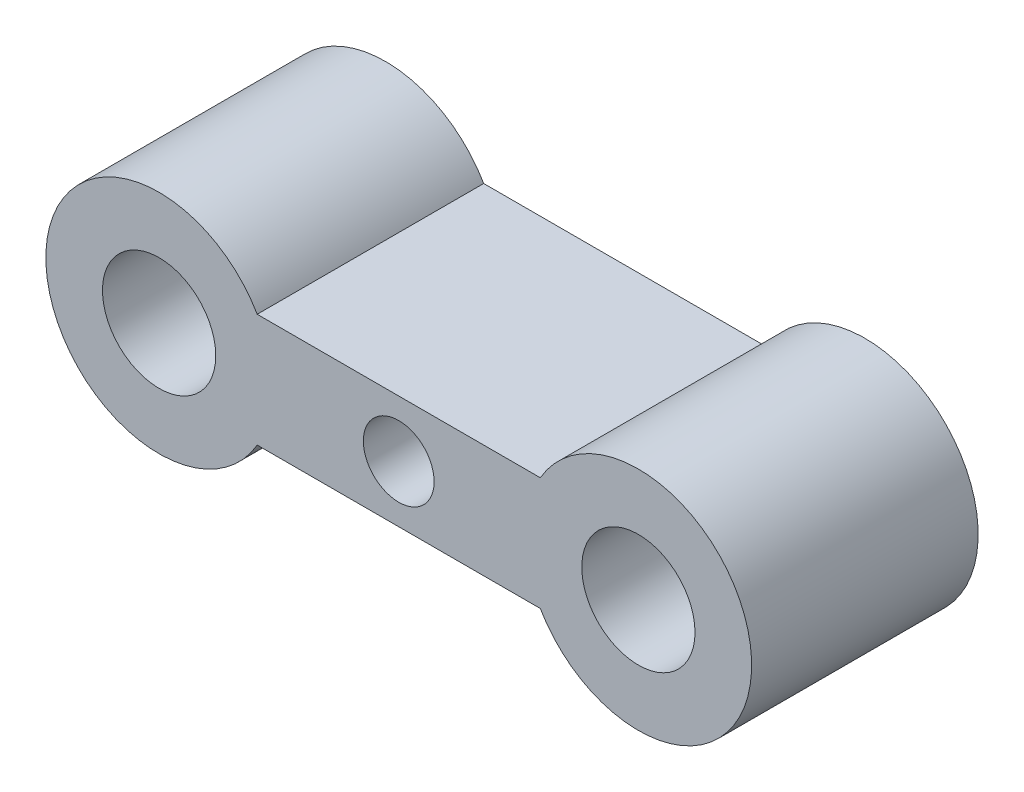
ISO-10303-21;
HEADER;
FILE_DESCRIPTION(('STEP AP214'),'2;1');
FILE_NAME('part.step','',(''),(''),'','','');
FILE_SCHEMA(('AUTOMOTIVE_DESIGN { 1 0 10303 214 1 1 1 1 }'));
ENDSEC;
DATA;
#1=APPLICATION_CONTEXT('core data for automotive mechanical design processes');
#2=APPLICATION_PROTOCOL_DEFINITION('international standard','automotive_design',2000,#1);
#3=PRODUCT_CONTEXT('',#1,'mechanical');
#4=PRODUCT('Part','Part','',(#3));
#5=PRODUCT_RELATED_PRODUCT_CATEGORY('part','',(#4));
#6=PRODUCT_DEFINITION_FORMATION('','',#4);
#7=PRODUCT_DEFINITION_CONTEXT('part definition',#1,'design');
#8=PRODUCT_DEFINITION('design','',#6,#7);
#9=PRODUCT_DEFINITION_SHAPE('','',#8);
#10=(LENGTH_UNIT() NAMED_UNIT(*) SI_UNIT(.MILLI.,.METRE.));
#11=(NAMED_UNIT(*) PLANE_ANGLE_UNIT() SI_UNIT($,.RADIAN.));
#12=(NAMED_UNIT(*) SI_UNIT($,.STERADIAN.) SOLID_ANGLE_UNIT());
#13=UNCERTAINTY_MEASURE_WITH_UNIT(LENGTH_MEASURE(1.E-05),#10,'distance_accuracy_value','');
#14=(GEOMETRIC_REPRESENTATION_CONTEXT(3) GLOBAL_UNCERTAINTY_ASSIGNED_CONTEXT((#13)) GLOBAL_UNIT_ASSIGNED_CONTEXT((#10,
#11,#12)) REPRESENTATION_CONTEXT('',''));
#15=CARTESIAN_POINT('',(0.,0.,0.));
#16=DIRECTION('',(0.,0.,1.));
#17=DIRECTION('',(1.,0.,0.));
#18=AXIS2_PLACEMENT_3D('',#15,#16,#17);
#19=CARTESIAN_POINT('',(0.,0.,8.));
#20=DIRECTION('',(0.,0.,-1.));
#21=DIRECTION('',(-1.,0.,0.));
#22=AXIS2_PLACEMENT_3D('',#19,#20,#21);
#23=CYLINDRICAL_SURFACE('',#22,4.);
#24=CARTESIAN_POINT('',(0.,0.,0.));
#25=DIRECTION('',(0.,0.,1.));
#26=DIRECTION('',(1.,0.,0.));
#27=AXIS2_PLACEMENT_3D('',#24,#25,#26);
#28=CIRCLE('',#27,4.);
#29=CARTESIAN_POINT('',(3.46410161513775,2.,0.));
#30=VERTEX_POINT('',#29);
#31=CARTESIAN_POINT('',(3.46410161513775,-2.,0.));
#32=VERTEX_POINT('',#31);
#33=EDGE_CURVE('E106',#30,#32,#28,.T.);
#34=ORIENTED_EDGE('',*,*,#33,.T.);
#35=DIRECTION('',(0.,0.,-1.));
#36=VECTOR('',#35,1.);
#37=CARTESIAN_POINT('',(3.46410161513775,-2.,8.));
#38=LINE('',#37,#36);
#39=CARTESIAN_POINT('',(3.46410161513775,-2.,8.));
#40=VERTEX_POINT('',#39);
#41=EDGE_CURVE('E11',#40,#32,#38,.T.);
#42=ORIENTED_EDGE('',*,*,#41,.F.);
#43=CARTESIAN_POINT('',(0.,0.,8.));
#44=DIRECTION('',(0.,0.,1.));
#45=DIRECTION('',(1.,0.,0.));
#46=AXIS2_PLACEMENT_3D('',#43,#44,#45);
#47=CIRCLE('',#46,4.);
#48=CARTESIAN_POINT('',(3.46410161513775,2.,8.));
#49=VERTEX_POINT('',#48);
#50=EDGE_CURVE('E86',#49,#40,#47,.T.);
#51=ORIENTED_EDGE('',*,*,#50,.F.);
#52=DIRECTION('',(0.,0.,-1.));
#53=VECTOR('',#52,1.);
#54=CARTESIAN_POINT('',(3.46410161513775,2.,8.));
#55=LINE('',#54,#53);
#56=EDGE_CURVE('E52',#49,#30,#55,.T.);
#57=ORIENTED_EDGE('',*,*,#56,.T.);
#58=EDGE_LOOP('',(#34,#42,#51,#57));
#59=FACE_BOUND('',#58,.T.);
#60=ADVANCED_FACE('F35',(#59),#23,.T.);
#61=CARTESIAN_POINT('',(0.,-2.,8.));
#62=DIRECTION('',(0.,1.,0.));
#63=DIRECTION('',(0.,0.,1.));
#64=AXIS2_PLACEMENT_3D('',#61,#62,#63);
#65=PLANE('',#64);
#66=DIRECTION('',(1.,0.,0.));
#67=VECTOR('',#66,1.);
#68=CARTESIAN_POINT('',(0.,-2.,0.));
#69=LINE('',#68,#67);
#70=CARTESIAN_POINT('',(13.4641016151378,-2.,0.));
#71=VERTEX_POINT('',#70);
#72=EDGE_CURVE('E91',#32,#71,#69,.T.);
#73=ORIENTED_EDGE('',*,*,#72,.T.);
#74=DIRECTION('',(0.,0.,-1.));
#75=VECTOR('',#74,1.);
#76=CARTESIAN_POINT('',(13.4641016151378,-2.,8.));
#77=LINE('',#76,#75);
#78=CARTESIAN_POINT('',(13.4641016151378,-2.,8.));
#79=VERTEX_POINT('',#78);
#80=EDGE_CURVE('E44',#79,#71,#77,.T.);
#81=ORIENTED_EDGE('',*,*,#80,.F.);
#82=DIRECTION('',(1.,0.,0.));
#83=VECTOR('',#82,1.);
#84=CARTESIAN_POINT('',(0.,-2.,8.));
#85=LINE('',#84,#83);
#86=EDGE_CURVE('E77',#40,#79,#85,.T.);
#87=ORIENTED_EDGE('',*,*,#86,.F.);
#88=ORIENTED_EDGE('',*,*,#41,.T.);
#89=EDGE_LOOP('',(#73,#81,#87,#88));
#90=FACE_BOUND('',#89,.T.);
#91=ADVANCED_FACE('F90',(#90),#65,.F.);
#92=CARTESIAN_POINT('',(16.9282032302755,0.,8.));
#93=DIRECTION('',(0.,0.,-1.));
#94=DIRECTION('',(-1.,0.,0.));
#95=AXIS2_PLACEMENT_3D('',#92,#93,#94);
#96=CYLINDRICAL_SURFACE('',#95,4.);
#97=CARTESIAN_POINT('',(16.9282032302755,0.,0.));
#98=DIRECTION('',(0.,0.,1.));
#99=DIRECTION('',(1.,0.,0.));
#100=AXIS2_PLACEMENT_3D('',#97,#98,#99);
#101=CIRCLE('',#100,4.);
#102=CARTESIAN_POINT('',(13.4641016151378,2.,0.));
#103=VERTEX_POINT('',#102);
#104=EDGE_CURVE('E110',#103,#71,#101,.F.);
#105=ORIENTED_EDGE('',*,*,#104,.F.);
#106=DIRECTION('',(0.,0.,-1.));
#107=VECTOR('',#106,1.);
#108=CARTESIAN_POINT('',(13.4641016151378,2.,8.));
#109=LINE('',#108,#107);
#110=CARTESIAN_POINT('',(13.4641016151378,2.,8.));
#111=VERTEX_POINT('',#110);
#112=EDGE_CURVE('E66',#111,#103,#109,.T.);
#113=ORIENTED_EDGE('',*,*,#112,.F.);
#114=CARTESIAN_POINT('',(16.9282032302755,0.,8.));
#115=DIRECTION('',(0.,0.,1.));
#116=DIRECTION('',(1.,0.,0.));
#117=AXIS2_PLACEMENT_3D('',#114,#115,#116);
#118=CIRCLE('',#117,4.);
#119=EDGE_CURVE('E85',#111,#79,#118,.F.);
#120=ORIENTED_EDGE('',*,*,#119,.T.);
#121=ORIENTED_EDGE('',*,*,#80,.T.);
#122=EDGE_LOOP('',(#105,#113,#120,#121));
#123=FACE_BOUND('',#122,.T.);
#124=ADVANCED_FACE('F94',(#123),#96,.T.);
#125=CARTESIAN_POINT('',(0.,2.,8.));
#126=DIRECTION('',(0.,1.,0.));
#127=DIRECTION('',(0.,0.,1.));
#128=AXIS2_PLACEMENT_3D('',#125,#126,#127);
#129=PLANE('',#128);
#130=DIRECTION('',(1.,0.,0.));
#131=VECTOR('',#130,1.);
#132=CARTESIAN_POINT('',(0.,2.,0.));
#133=LINE('',#132,#131);
#134=EDGE_CURVE('E112',#30,#103,#133,.T.);
#135=ORIENTED_EDGE('',*,*,#134,.F.);
#136=ORIENTED_EDGE('',*,*,#56,.F.);
#137=DIRECTION('',(1.,0.,0.));
#138=VECTOR('',#137,1.);
#139=CARTESIAN_POINT('',(0.,2.,8.));
#140=LINE('',#139,#138);
#141=EDGE_CURVE('E95',#49,#111,#140,.T.);
#142=ORIENTED_EDGE('',*,*,#141,.T.);
#143=ORIENTED_EDGE('',*,*,#112,.T.);
#144=EDGE_LOOP('',(#135,#136,#142,#143));
#145=FACE_BOUND('',#144,.T.);
#146=ADVANCED_FACE('F142',(#145),#129,.T.);
#147=CARTESIAN_POINT('',(0.,0.,8.));
#148=DIRECTION('',(0.,0.,-1.));
#149=DIRECTION('',(-1.,0.,0.));
#150=AXIS2_PLACEMENT_3D('',#147,#148,#149);
#151=CYLINDRICAL_SURFACE('',#150,2.);
#152=CARTESIAN_POINT('',(0.,0.,8.));
#153=DIRECTION('',(0.,0.,1.));
#154=DIRECTION('',(1.,0.,0.));
#155=AXIS2_PLACEMENT_3D('',#152,#153,#154);
#156=CIRCLE('',#155,2.);
#157=CARTESIAN_POINT('',(2.,0.,8.));
#158=VERTEX_POINT('',#157);
#159=EDGE_CURVE('E118',#158,#158,#156,.T.);
#160=ORIENTED_EDGE('',*,*,#159,.T.);
#161=EDGE_LOOP('',(#160));
#162=FACE_BOUND('',#161,.T.);
#163=CARTESIAN_POINT('',(0.,0.,0.));
#164=DIRECTION('',(0.,0.,1.));
#165=DIRECTION('',(1.,0.,0.));
#166=AXIS2_PLACEMENT_3D('',#163,#164,#165);
#167=CIRCLE('',#166,2.);
#168=CARTESIAN_POINT('',(2.,0.,0.));
#169=VERTEX_POINT('',#168);
#170=EDGE_CURVE('E103',#169,#169,#167,.T.);
#171=ORIENTED_EDGE('',*,*,#170,.F.);
#172=EDGE_LOOP('',(#171));
#173=FACE_BOUND('',#172,.T.);
#174=ADVANCED_FACE('F37',(#162,#173),#151,.F.);
#175=CARTESIAN_POINT('',(16.9282032302755,0.,8.));
#176=DIRECTION('',(0.,0.,-1.));
#177=DIRECTION('',(-1.,0.,0.));
#178=AXIS2_PLACEMENT_3D('',#175,#176,#177);
#179=CYLINDRICAL_SURFACE('',#178,2.);
#180=CARTESIAN_POINT('',(16.9282032302755,0.,8.));
#181=DIRECTION('',(0.,0.,1.));
#182=DIRECTION('',(1.,0.,0.));
#183=AXIS2_PLACEMENT_3D('',#180,#181,#182);
#184=CIRCLE('',#183,2.);
#185=CARTESIAN_POINT('',(18.9282032302755,0.,8.));
#186=VERTEX_POINT('',#185);
#187=EDGE_CURVE('E97',#186,#186,#184,.F.);
#188=ORIENTED_EDGE('',*,*,#187,.F.);
#189=EDGE_LOOP('',(#188));
#190=FACE_BOUND('',#189,.T.);
#191=CARTESIAN_POINT('',(16.9282032302755,0.,0.));
#192=DIRECTION('',(0.,0.,1.));
#193=DIRECTION('',(1.,0.,0.));
#194=AXIS2_PLACEMENT_3D('',#191,#192,#193);
#195=CIRCLE('',#194,2.);
#196=CARTESIAN_POINT('',(18.9282032302755,0.,0.));
#197=VERTEX_POINT('',#196);
#198=EDGE_CURVE('E115',#197,#197,#195,.F.);
#199=ORIENTED_EDGE('',*,*,#198,.T.);
#200=EDGE_LOOP('',(#199));
#201=FACE_BOUND('',#200,.T.);
#202=ADVANCED_FACE('F149',(#190,#201),#179,.F.);
#203=CARTESIAN_POINT('',(0.,0.,8.));
#204=DIRECTION('',(0.,0.,1.));
#205=DIRECTION('',(1.,0.,0.));
#206=AXIS2_PLACEMENT_3D('',#203,#204,#205);
#207=PLANE('',#206);
#208=CARTESIAN_POINT('',(8.46410161513776,0.,8.));
#209=DIRECTION('',(0.,0.,1.));
#210=DIRECTION('',(1.,0.,0.));
#211=AXIS2_PLACEMENT_3D('',#208,#209,#210);
#212=CIRCLE('',#211,1.25);
#213=CARTESIAN_POINT('',(9.71410161513775,0.,8.));
#214=VERTEX_POINT('',#213);
#215=EDGE_CURVE('E107',#214,#214,#212,.T.);
#216=ORIENTED_EDGE('',*,*,#215,.F.);
#217=EDGE_LOOP('',(#216));
#218=FACE_BOUND('',#217,.T.);
#219=ORIENTED_EDGE('',*,*,#159,.F.);
#220=EDGE_LOOP('',(#219));
#221=FACE_BOUND('',#220,.T.);
#222=ORIENTED_EDGE('',*,*,#50,.T.);
#223=ORIENTED_EDGE('',*,*,#86,.T.);
#224=ORIENTED_EDGE('',*,*,#119,.F.);
#225=ORIENTED_EDGE('',*,*,#141,.F.);
#226=EDGE_LOOP('',(#222,#223,#224,#225));
#227=FACE_BOUND('',#226,.T.);
#228=ORIENTED_EDGE('',*,*,#187,.T.);
#229=EDGE_LOOP('',(#228));
#230=FACE_BOUND('',#229,.T.);
#231=ADVANCED_FACE('F81',(#218,#221,#227,#230),#207,.T.);
#232=CARTESIAN_POINT('',(0.,0.,0.));
#233=DIRECTION('',(0.,0.,1.));
#234=DIRECTION('',(1.,0.,0.));
#235=AXIS2_PLACEMENT_3D('',#232,#233,#234);
#236=PLANE('',#235);
#237=CARTESIAN_POINT('',(8.46410161513776,0.,0.));
#238=DIRECTION('',(0.,0.,-1.));
#239=DIRECTION('',(-1.,0.,0.));
#240=AXIS2_PLACEMENT_3D('',#237,#238,#239);
#241=CIRCLE('',#240,1.25);
#242=CARTESIAN_POINT('',(7.21410161513775,0.,0.));
#243=VERTEX_POINT('',#242);
#244=EDGE_CURVE('E129',#243,#243,#241,.T.);
#245=ORIENTED_EDGE('',*,*,#244,.F.);
#246=EDGE_LOOP('',(#245));
#247=FACE_BOUND('',#246,.T.);
#248=ORIENTED_EDGE('',*,*,#170,.T.);
#249=EDGE_LOOP('',(#248));
#250=FACE_BOUND('',#249,.T.);
#251=ORIENTED_EDGE('',*,*,#33,.F.);
#252=ORIENTED_EDGE('',*,*,#134,.T.);
#253=ORIENTED_EDGE('',*,*,#104,.T.);
#254=ORIENTED_EDGE('',*,*,#72,.F.);
#255=EDGE_LOOP('',(#251,#252,#253,#254));
#256=FACE_BOUND('',#255,.T.);
#257=ORIENTED_EDGE('',*,*,#198,.F.);
#258=EDGE_LOOP('',(#257));
#259=FACE_BOUND('',#258,.T.);
#260=ADVANCED_FACE('F135',(#247,#250,#256,#259),#236,.F.);
#261=CARTESIAN_POINT('',(8.46410161513776,0.,21.5));
#262=DIRECTION('',(0.,0.,-1.));
#263=DIRECTION('',(-1.,0.,0.));
#264=AXIS2_PLACEMENT_3D('',#261,#262,#263);
#265=CYLINDRICAL_SURFACE('',#264,1.25);
#266=ORIENTED_EDGE('',*,*,#215,.T.);
#267=EDGE_LOOP('',(#266));
#268=FACE_BOUND('',#267,.T.);
#269=ORIENTED_EDGE('',*,*,#244,.T.);
#270=EDGE_LOOP('',(#269));
#271=FACE_BOUND('',#270,.T.);
#272=ADVANCED_FACE('F133',(#268,#271),#265,.F.);
#273=CLOSED_SHELL('',(#60,#91,#124,#146,#174,#202,#231,#260,#272));
#274=MANIFOLD_SOLID_BREP('B2',#273);
#275=ADVANCED_BREP_SHAPE_REPRESENTATION('',(#18,#274),#14);
#276=SHAPE_DEFINITION_REPRESENTATION(#9,#275);
ENDSEC;
END-ISO-10303-21;
